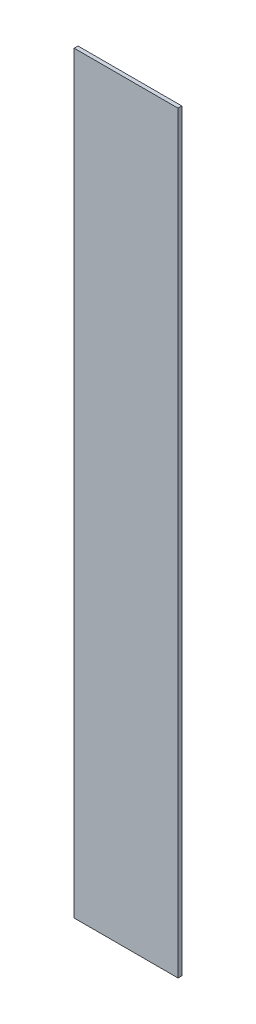
ISO-10303-21;
HEADER;
FILE_DESCRIPTION(('STEP AP214'),'2;1');
FILE_NAME('part.step','',(''),(''),'','','');
FILE_SCHEMA(('AUTOMOTIVE_DESIGN { 1 0 10303 214 1 1 1 1 }'));
ENDSEC;
DATA;
#1=APPLICATION_CONTEXT('core data for automotive mechanical design processes');
#2=APPLICATION_PROTOCOL_DEFINITION('international standard','automotive_design',2000,#1);
#3=PRODUCT_CONTEXT('',#1,'mechanical');
#4=PRODUCT('Part','Part','',(#3));
#5=PRODUCT_RELATED_PRODUCT_CATEGORY('part','',(#4));
#6=PRODUCT_DEFINITION_FORMATION('','',#4);
#7=PRODUCT_DEFINITION_CONTEXT('part definition',#1,'design');
#8=PRODUCT_DEFINITION('design','',#6,#7);
#9=PRODUCT_DEFINITION_SHAPE('','',#8);
#10=(LENGTH_UNIT() NAMED_UNIT(*) SI_UNIT(.MILLI.,.METRE.));
#11=(NAMED_UNIT(*) PLANE_ANGLE_UNIT() SI_UNIT($,.RADIAN.));
#12=(NAMED_UNIT(*) SI_UNIT($,.STERADIAN.) SOLID_ANGLE_UNIT());
#13=UNCERTAINTY_MEASURE_WITH_UNIT(LENGTH_MEASURE(1.E-05),#10,'distance_accuracy_value','');
#14=(GEOMETRIC_REPRESENTATION_CONTEXT(3) GLOBAL_UNCERTAINTY_ASSIGNED_CONTEXT((#13)) GLOBAL_UNIT_ASSIGNED_CONTEXT((#10,
#11,#12)) REPRESENTATION_CONTEXT('',''));
#15=CARTESIAN_POINT('',(0.,0.,0.));
#16=DIRECTION('',(0.,0.,1.));
#17=DIRECTION('',(1.,0.,0.));
#18=AXIS2_PLACEMENT_3D('',#15,#16,#17);
#19=CARTESIAN_POINT('',(171.45,-1244.6,12.7));
#20=DIRECTION('',(-1.,0.,0.));
#21=DIRECTION('',(0.,0.,1.));
#22=AXIS2_PLACEMENT_3D('',#19,#20,#21);
#23=PLANE('',#22);
#24=DIRECTION('',(0.,1.,0.));
#25=VECTOR('',#24,1.);
#26=CARTESIAN_POINT('',(171.45,-1244.6,0.));
#27=LINE('',#26,#25);
#28=CARTESIAN_POINT('',(171.45,-1244.6,0.));
#29=VERTEX_POINT('',#28);
#30=CARTESIAN_POINT('',(171.45,1244.6,0.));
#31=VERTEX_POINT('',#30);
#32=EDGE_CURVE('E96',#29,#31,#27,.T.);
#33=ORIENTED_EDGE('',*,*,#32,.T.);
#34=DIRECTION('',(0.,0.,-1.));
#35=VECTOR('',#34,1.);
#36=CARTESIAN_POINT('',(171.45,1244.6,12.7));
#37=LINE('',#36,#35);
#38=CARTESIAN_POINT('',(171.45,1244.6,12.7));
#39=VERTEX_POINT('',#38);
#40=EDGE_CURVE('E11',#39,#31,#37,.T.);
#41=ORIENTED_EDGE('',*,*,#40,.F.);
#42=DIRECTION('',(0.,1.,0.));
#43=VECTOR('',#42,1.);
#44=CARTESIAN_POINT('',(171.45,-1244.6,12.7));
#45=LINE('',#44,#43);
#46=CARTESIAN_POINT('',(171.45,-1244.6,12.7));
#47=VERTEX_POINT('',#46);
#48=EDGE_CURVE('E84',#47,#39,#45,.T.);
#49=ORIENTED_EDGE('',*,*,#48,.F.);
#50=DIRECTION('',(0.,0.,-1.));
#51=VECTOR('',#50,1.);
#52=CARTESIAN_POINT('',(171.45,-1244.6,12.7));
#53=LINE('',#52,#51);
#54=EDGE_CURVE('E92',#47,#29,#53,.T.);
#55=ORIENTED_EDGE('',*,*,#54,.T.);
#56=EDGE_LOOP('',(#33,#41,#49,#55));
#57=FACE_BOUND('',#56,.T.);
#58=ADVANCED_FACE('F33',(#57),#23,.F.);
#59=CARTESIAN_POINT('',(-171.45,1244.6,12.7));
#60=DIRECTION('',(0.,-1.,0.));
#61=DIRECTION('',(0.,0.,-1.));
#62=AXIS2_PLACEMENT_3D('',#59,#60,#61);
#63=PLANE('',#62);
#64=DIRECTION('',(-1.,0.,0.));
#65=VECTOR('',#64,1.);
#66=CARTESIAN_POINT('',(-171.45,1244.6,0.));
#67=LINE('',#66,#65);
#68=CARTESIAN_POINT('',(-171.45,1244.6,0.));
#69=VERTEX_POINT('',#68);
#70=EDGE_CURVE('E88',#31,#69,#67,.T.);
#71=ORIENTED_EDGE('',*,*,#70,.T.);
#72=DIRECTION('',(0.,0.,-1.));
#73=VECTOR('',#72,1.);
#74=CARTESIAN_POINT('',(-171.45,1244.6,12.7));
#75=LINE('',#74,#73);
#76=CARTESIAN_POINT('',(-171.45,1244.6,12.7));
#77=VERTEX_POINT('',#76);
#78=EDGE_CURVE('E41',#77,#69,#75,.T.);
#79=ORIENTED_EDGE('',*,*,#78,.F.);
#80=DIRECTION('',(-1.,0.,0.));
#81=VECTOR('',#80,1.);
#82=CARTESIAN_POINT('',(-171.45,1244.6,12.7));
#83=LINE('',#82,#81);
#84=EDGE_CURVE('E79',#39,#77,#83,.T.);
#85=ORIENTED_EDGE('',*,*,#84,.F.);
#86=ORIENTED_EDGE('',*,*,#40,.T.);
#87=EDGE_LOOP('',(#71,#79,#85,#86));
#88=FACE_BOUND('',#87,.T.);
#89=ADVANCED_FACE('F87',(#88),#63,.F.);
#90=CARTESIAN_POINT('',(-171.45,-1244.6,12.7));
#91=DIRECTION('',(1.,0.,0.));
#92=DIRECTION('',(0.,0.,-1.));
#93=AXIS2_PLACEMENT_3D('',#90,#91,#92);
#94=PLANE('',#93);
#95=DIRECTION('',(0.,-1.,0.));
#96=VECTOR('',#95,1.);
#97=CARTESIAN_POINT('',(-171.45,-1244.6,0.));
#98=LINE('',#97,#96);
#99=CARTESIAN_POINT('',(-171.45,-1244.6,0.));
#100=VERTEX_POINT('',#99);
#101=EDGE_CURVE('E66',#69,#100,#98,.T.);
#102=ORIENTED_EDGE('',*,*,#101,.T.);
#103=DIRECTION('',(0.,0.,-1.));
#104=VECTOR('',#103,1.);
#105=CARTESIAN_POINT('',(-171.45,-1244.6,12.7));
#106=LINE('',#105,#104);
#107=CARTESIAN_POINT('',(-171.45,-1244.6,12.7));
#108=VERTEX_POINT('',#107);
#109=EDGE_CURVE('E89',#108,#100,#106,.T.);
#110=ORIENTED_EDGE('',*,*,#109,.F.);
#111=DIRECTION('',(0.,-1.,0.));
#112=VECTOR('',#111,1.);
#113=CARTESIAN_POINT('',(-171.45,-1244.6,12.7));
#114=LINE('',#113,#112);
#115=EDGE_CURVE('E82',#77,#108,#114,.T.);
#116=ORIENTED_EDGE('',*,*,#115,.F.);
#117=ORIENTED_EDGE('',*,*,#78,.T.);
#118=EDGE_LOOP('',(#102,#110,#116,#117));
#119=FACE_BOUND('',#118,.T.);
#120=ADVANCED_FACE('F90',(#119),#94,.F.);
#121=CARTESIAN_POINT('',(-171.45,-1244.6,12.7));
#122=DIRECTION('',(0.,1.,0.));
#123=DIRECTION('',(0.,0.,1.));
#124=AXIS2_PLACEMENT_3D('',#121,#122,#123);
#125=PLANE('',#124);
#126=DIRECTION('',(1.,0.,0.));
#127=VECTOR('',#126,1.);
#128=CARTESIAN_POINT('',(-171.45,-1244.6,0.));
#129=LINE('',#128,#127);
#130=EDGE_CURVE('E72',#100,#29,#129,.T.);
#131=ORIENTED_EDGE('',*,*,#130,.T.);
#132=ORIENTED_EDGE('',*,*,#54,.F.);
#133=DIRECTION('',(1.,0.,0.));
#134=VECTOR('',#133,1.);
#135=CARTESIAN_POINT('',(-171.45,-1244.6,12.7));
#136=LINE('',#135,#134);
#137=EDGE_CURVE('E49',#108,#47,#136,.T.);
#138=ORIENTED_EDGE('',*,*,#137,.F.);
#139=ORIENTED_EDGE('',*,*,#109,.T.);
#140=EDGE_LOOP('',(#131,#132,#138,#139));
#141=FACE_BOUND('',#140,.T.);
#142=ADVANCED_FACE('F103',(#141),#125,.F.);
#143=CARTESIAN_POINT('',(0.,0.,12.7));
#144=DIRECTION('',(0.,0.,-1.));
#145=DIRECTION('',(-1.,0.,0.));
#146=AXIS2_PLACEMENT_3D('',#143,#144,#145);
#147=PLANE('',#146);
#148=ORIENTED_EDGE('',*,*,#48,.T.);
#149=ORIENTED_EDGE('',*,*,#84,.T.);
#150=ORIENTED_EDGE('',*,*,#115,.T.);
#151=ORIENTED_EDGE('',*,*,#137,.T.);
#152=EDGE_LOOP('',(#148,#149,#150,#151));
#153=FACE_BOUND('',#152,.T.);
#154=ADVANCED_FACE('F80',(#153),#147,.F.);
#155=CARTESIAN_POINT('',(0.,0.,0.));
#156=DIRECTION('',(0.,0.,-1.));
#157=DIRECTION('',(-1.,0.,0.));
#158=AXIS2_PLACEMENT_3D('',#155,#156,#157);
#159=PLANE('',#158);
#160=ORIENTED_EDGE('',*,*,#32,.F.);
#161=ORIENTED_EDGE('',*,*,#130,.F.);
#162=ORIENTED_EDGE('',*,*,#101,.F.);
#163=ORIENTED_EDGE('',*,*,#70,.F.);
#164=EDGE_LOOP('',(#160,#161,#162,#163));
#165=FACE_BOUND('',#164,.T.);
#166=ADVANCED_FACE('F106',(#165),#159,.T.);
#167=CLOSED_SHELL('',(#58,#89,#120,#142,#154,#166));
#168=MANIFOLD_SOLID_BREP('B2',#167);
#169=ADVANCED_BREP_SHAPE_REPRESENTATION('',(#18,#168),#14);
#170=SHAPE_DEFINITION_REPRESENTATION(#9,#169);
ENDSEC;
END-ISO-10303-21;
